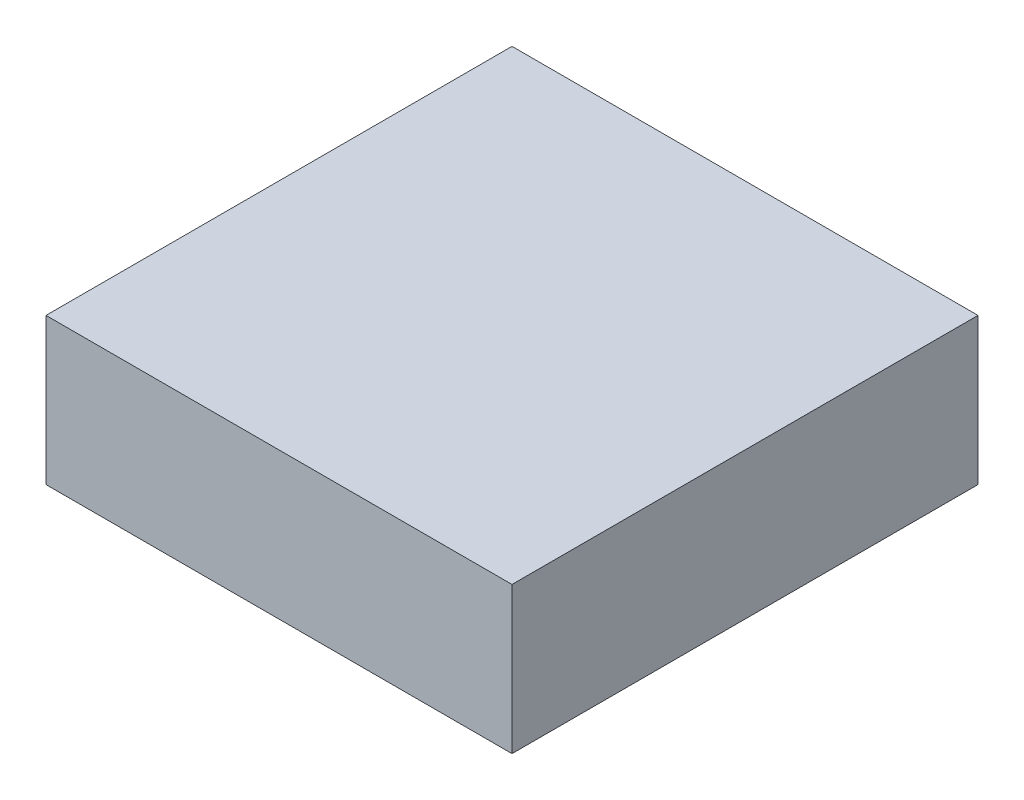
ISO-10303-21;
HEADER;
FILE_DESCRIPTION(('STEP AP214'),'2;1');
FILE_NAME('part.step','',(''),(''),'','','');
FILE_SCHEMA(('AUTOMOTIVE_DESIGN { 1 0 10303 214 1 1 1 1 }'));
ENDSEC;
DATA;
#1=APPLICATION_CONTEXT('core data for automotive mechanical design processes');
#2=APPLICATION_PROTOCOL_DEFINITION('international standard','automotive_design',2000,#1);
#3=PRODUCT_CONTEXT('',#1,'mechanical');
#4=PRODUCT('Part','Part','',(#3));
#5=PRODUCT_RELATED_PRODUCT_CATEGORY('part','',(#4));
#6=PRODUCT_DEFINITION_FORMATION('','',#4);
#7=PRODUCT_DEFINITION_CONTEXT('part definition',#1,'design');
#8=PRODUCT_DEFINITION('design','',#6,#7);
#9=PRODUCT_DEFINITION_SHAPE('','',#8);
#10=(LENGTH_UNIT() NAMED_UNIT(*) SI_UNIT(.MILLI.,.METRE.));
#11=(NAMED_UNIT(*) PLANE_ANGLE_UNIT() SI_UNIT($,.RADIAN.));
#12=(NAMED_UNIT(*) SI_UNIT($,.STERADIAN.) SOLID_ANGLE_UNIT());
#13=UNCERTAINTY_MEASURE_WITH_UNIT(LENGTH_MEASURE(1.E-05),#10,'distance_accuracy_value','');
#14=(GEOMETRIC_REPRESENTATION_CONTEXT(3) GLOBAL_UNCERTAINTY_ASSIGNED_CONTEXT((#13)) GLOBAL_UNIT_ASSIGNED_CONTEXT((#10,
#11,#12)) REPRESENTATION_CONTEXT('',''));
#15=CARTESIAN_POINT('',(0.,0.,0.));
#16=DIRECTION('',(0.,0.,1.));
#17=DIRECTION('',(1.,0.,0.));
#18=AXIS2_PLACEMENT_3D('',#15,#16,#17);
#19=CARTESIAN_POINT('',(15.9,10.,15.9));
#20=DIRECTION('',(-1.,0.,0.));
#21=DIRECTION('',(0.,0.,1.));
#22=AXIS2_PLACEMENT_3D('',#19,#20,#21);
#23=PLANE('',#22);
#24=DIRECTION('',(0.,0.,-1.));
#25=VECTOR('',#24,1.);
#26=CARTESIAN_POINT('',(15.9,0.,15.9));
#27=LINE('',#26,#25);
#28=CARTESIAN_POINT('',(15.9,0.,15.9));
#29=VERTEX_POINT('',#28);
#30=CARTESIAN_POINT('',(15.9,0.,-15.9));
#31=VERTEX_POINT('',#30);
#32=EDGE_CURVE('E96',#29,#31,#27,.T.);
#33=ORIENTED_EDGE('',*,*,#32,.T.);
#34=DIRECTION('',(0.,-1.,0.));
#35=VECTOR('',#34,1.);
#36=CARTESIAN_POINT('',(15.9,10.,-15.9));
#37=LINE('',#36,#35);
#38=CARTESIAN_POINT('',(15.9,10.,-15.9));
#39=VERTEX_POINT('',#38);
#40=EDGE_CURVE('E11',#39,#31,#37,.T.);
#41=ORIENTED_EDGE('',*,*,#40,.F.);
#42=DIRECTION('',(0.,0.,-1.));
#43=VECTOR('',#42,1.);
#44=CARTESIAN_POINT('',(15.9,10.,15.9));
#45=LINE('',#44,#43);
#46=CARTESIAN_POINT('',(15.9,10.,15.9));
#47=VERTEX_POINT('',#46);
#48=EDGE_CURVE('E84',#47,#39,#45,.T.);
#49=ORIENTED_EDGE('',*,*,#48,.F.);
#50=DIRECTION('',(0.,-1.,0.));
#51=VECTOR('',#50,1.);
#52=CARTESIAN_POINT('',(15.9,10.,15.9));
#53=LINE('',#52,#51);
#54=EDGE_CURVE('E92',#47,#29,#53,.T.);
#55=ORIENTED_EDGE('',*,*,#54,.T.);
#56=EDGE_LOOP('',(#33,#41,#49,#55));
#57=FACE_BOUND('',#56,.T.);
#58=ADVANCED_FACE('F33',(#57),#23,.F.);
#59=CARTESIAN_POINT('',(-15.9,10.,-15.9));
#60=DIRECTION('',(0.,0.,1.));
#61=DIRECTION('',(1.,0.,0.));
#62=AXIS2_PLACEMENT_3D('',#59,#60,#61);
#63=PLANE('',#62);
#64=DIRECTION('',(-1.,0.,0.));
#65=VECTOR('',#64,1.);
#66=CARTESIAN_POINT('',(-15.9,0.,-15.9));
#67=LINE('',#66,#65);
#68=CARTESIAN_POINT('',(-15.9,0.,-15.9));
#69=VERTEX_POINT('',#68);
#70=EDGE_CURVE('E88',#31,#69,#67,.T.);
#71=ORIENTED_EDGE('',*,*,#70,.T.);
#72=DIRECTION('',(0.,-1.,0.));
#73=VECTOR('',#72,1.);
#74=CARTESIAN_POINT('',(-15.9,10.,-15.9));
#75=LINE('',#74,#73);
#76=CARTESIAN_POINT('',(-15.9,10.,-15.9));
#77=VERTEX_POINT('',#76);
#78=EDGE_CURVE('E41',#77,#69,#75,.T.);
#79=ORIENTED_EDGE('',*,*,#78,.F.);
#80=DIRECTION('',(-1.,0.,0.));
#81=VECTOR('',#80,1.);
#82=CARTESIAN_POINT('',(-15.9,10.,-15.9));
#83=LINE('',#82,#81);
#84=EDGE_CURVE('E79',#39,#77,#83,.T.);
#85=ORIENTED_EDGE('',*,*,#84,.F.);
#86=ORIENTED_EDGE('',*,*,#40,.T.);
#87=EDGE_LOOP('',(#71,#79,#85,#86));
#88=FACE_BOUND('',#87,.T.);
#89=ADVANCED_FACE('F87',(#88),#63,.F.);
#90=CARTESIAN_POINT('',(-15.9,10.,15.9));
#91=DIRECTION('',(1.,0.,0.));
#92=DIRECTION('',(0.,0.,-1.));
#93=AXIS2_PLACEMENT_3D('',#90,#91,#92);
#94=PLANE('',#93);
#95=DIRECTION('',(0.,0.,1.));
#96=VECTOR('',#95,1.);
#97=CARTESIAN_POINT('',(-15.9,0.,15.9));
#98=LINE('',#97,#96);
#99=CARTESIAN_POINT('',(-15.9,0.,15.9));
#100=VERTEX_POINT('',#99);
#101=EDGE_CURVE('E66',#69,#100,#98,.T.);
#102=ORIENTED_EDGE('',*,*,#101,.T.);
#103=DIRECTION('',(0.,-1.,0.));
#104=VECTOR('',#103,1.);
#105=CARTESIAN_POINT('',(-15.9,10.,15.9));
#106=LINE('',#105,#104);
#107=CARTESIAN_POINT('',(-15.9,10.,15.9));
#108=VERTEX_POINT('',#107);
#109=EDGE_CURVE('E89',#108,#100,#106,.T.);
#110=ORIENTED_EDGE('',*,*,#109,.F.);
#111=DIRECTION('',(0.,0.,1.));
#112=VECTOR('',#111,1.);
#113=CARTESIAN_POINT('',(-15.9,10.,15.9));
#114=LINE('',#113,#112);
#115=EDGE_CURVE('E82',#77,#108,#114,.T.);
#116=ORIENTED_EDGE('',*,*,#115,.F.);
#117=ORIENTED_EDGE('',*,*,#78,.T.);
#118=EDGE_LOOP('',(#102,#110,#116,#117));
#119=FACE_BOUND('',#118,.T.);
#120=ADVANCED_FACE('F90',(#119),#94,.F.);
#121=CARTESIAN_POINT('',(-15.9,10.,15.9));
#122=DIRECTION('',(0.,0.,-1.));
#123=DIRECTION('',(-1.,0.,0.));
#124=AXIS2_PLACEMENT_3D('',#121,#122,#123);
#125=PLANE('',#124);
#126=DIRECTION('',(1.,0.,0.));
#127=VECTOR('',#126,1.);
#128=CARTESIAN_POINT('',(-15.9,0.,15.9));
#129=LINE('',#128,#127);
#130=EDGE_CURVE('E72',#100,#29,#129,.T.);
#131=ORIENTED_EDGE('',*,*,#130,.T.);
#132=ORIENTED_EDGE('',*,*,#54,.F.);
#133=DIRECTION('',(1.,0.,0.));
#134=VECTOR('',#133,1.);
#135=CARTESIAN_POINT('',(-15.9,10.,15.9));
#136=LINE('',#135,#134);
#137=EDGE_CURVE('E49',#108,#47,#136,.T.);
#138=ORIENTED_EDGE('',*,*,#137,.F.);
#139=ORIENTED_EDGE('',*,*,#109,.T.);
#140=EDGE_LOOP('',(#131,#132,#138,#139));
#141=FACE_BOUND('',#140,.T.);
#142=ADVANCED_FACE('F103',(#141),#125,.F.);
#143=CARTESIAN_POINT('',(0.,10.,0.));
#144=DIRECTION('',(0.,-1.,0.));
#145=DIRECTION('',(0.,0.,-1.));
#146=AXIS2_PLACEMENT_3D('',#143,#144,#145);
#147=PLANE('',#146);
#148=ORIENTED_EDGE('',*,*,#48,.T.);
#149=ORIENTED_EDGE('',*,*,#84,.T.);
#150=ORIENTED_EDGE('',*,*,#115,.T.);
#151=ORIENTED_EDGE('',*,*,#137,.T.);
#152=EDGE_LOOP('',(#148,#149,#150,#151));
#153=FACE_BOUND('',#152,.T.);
#154=ADVANCED_FACE('F80',(#153),#147,.F.);
#155=CARTESIAN_POINT('',(0.,0.,0.));
#156=DIRECTION('',(0.,-1.,0.));
#157=DIRECTION('',(0.,0.,-1.));
#158=AXIS2_PLACEMENT_3D('',#155,#156,#157);
#159=PLANE('',#158);
#160=ORIENTED_EDGE('',*,*,#32,.F.);
#161=ORIENTED_EDGE('',*,*,#130,.F.);
#162=ORIENTED_EDGE('',*,*,#101,.F.);
#163=ORIENTED_EDGE('',*,*,#70,.F.);
#164=EDGE_LOOP('',(#160,#161,#162,#163));
#165=FACE_BOUND('',#164,.T.);
#166=ADVANCED_FACE('F106',(#165),#159,.T.);
#167=CLOSED_SHELL('',(#58,#89,#120,#142,#154,#166));
#168=MANIFOLD_SOLID_BREP('B2',#167);
#169=ADVANCED_BREP_SHAPE_REPRESENTATION('',(#18,#168),#14);
#170=SHAPE_DEFINITION_REPRESENTATION(#9,#169);
ENDSEC;
END-ISO-10303-21;
